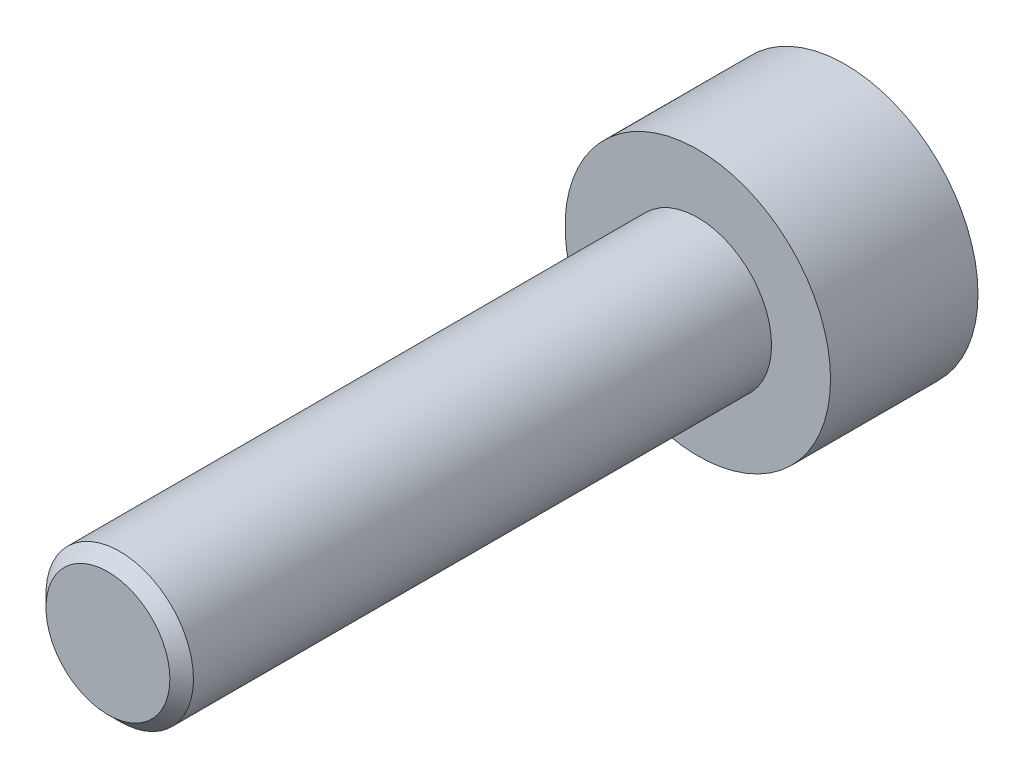
ISO-10303-21;
HEADER;
FILE_DESCRIPTION(('STEP AP214'),'2;1');
FILE_NAME('part.step','',(''),(''),'','','');
FILE_SCHEMA(('AUTOMOTIVE_DESIGN { 1 0 10303 214 1 1 1 1 }'));
ENDSEC;
DATA;
#1=APPLICATION_CONTEXT('core data for automotive mechanical design processes');
#2=APPLICATION_PROTOCOL_DEFINITION('international standard','automotive_design',2000,#1);
#3=PRODUCT_CONTEXT('',#1,'mechanical');
#4=PRODUCT('Part','Part','',(#3));
#5=PRODUCT_RELATED_PRODUCT_CATEGORY('part','',(#4));
#6=PRODUCT_DEFINITION_FORMATION('','',#4);
#7=PRODUCT_DEFINITION_CONTEXT('part definition',#1,'design');
#8=PRODUCT_DEFINITION('design','',#6,#7);
#9=PRODUCT_DEFINITION_SHAPE('','',#8);
#10=(LENGTH_UNIT() NAMED_UNIT(*) SI_UNIT(.MILLI.,.METRE.));
#11=(NAMED_UNIT(*) PLANE_ANGLE_UNIT() SI_UNIT($,.RADIAN.));
#12=(NAMED_UNIT(*) SI_UNIT($,.STERADIAN.) SOLID_ANGLE_UNIT());
#13=UNCERTAINTY_MEASURE_WITH_UNIT(LENGTH_MEASURE(1.E-05),#10,'distance_accuracy_value','');
#14=(GEOMETRIC_REPRESENTATION_CONTEXT(3) GLOBAL_UNCERTAINTY_ASSIGNED_CONTEXT((#13)) GLOBAL_UNIT_ASSIGNED_CONTEXT((#10,
#11,#12)) REPRESENTATION_CONTEXT('',''));
#15=CARTESIAN_POINT('',(0.,0.,0.));
#16=DIRECTION('',(0.,0.,1.));
#17=DIRECTION('',(1.,0.,0.));
#18=AXIS2_PLACEMENT_3D('',#15,#16,#17);
#19=CARTESIAN_POINT('',(0.,0.,2.5));
#20=DIRECTION('',(0.,0.,-1.));
#21=DIRECTION('',(-1.,0.,0.));
#22=AXIS2_PLACEMENT_3D('',#19,#20,#21);
#23=CYLINDRICAL_SURFACE('',#22,2.25);
#24=CARTESIAN_POINT('',(0.,0.,2.5));
#25=DIRECTION('',(0.,0.,1.));
#26=DIRECTION('',(1.,0.,0.));
#27=AXIS2_PLACEMENT_3D('',#24,#25,#26);
#28=CIRCLE('',#27,2.25);
#29=CARTESIAN_POINT('',(2.25,0.,2.5));
#30=VERTEX_POINT('',#29);
#31=EDGE_CURVE('E171',#30,#30,#28,.T.);
#32=ORIENTED_EDGE('',*,*,#31,.F.);
#33=EDGE_LOOP('',(#32));
#34=FACE_BOUND('',#33,.T.);
#35=CARTESIAN_POINT('',(0.,0.,0.));
#36=DIRECTION('',(0.,0.,1.));
#37=DIRECTION('',(1.,0.,0.));
#38=AXIS2_PLACEMENT_3D('',#35,#36,#37);
#39=CIRCLE('',#38,2.25);
#40=CARTESIAN_POINT('',(2.25,0.,0.));
#41=VERTEX_POINT('',#40);
#42=EDGE_CURVE('E157',#41,#41,#39,.T.);
#43=ORIENTED_EDGE('',*,*,#42,.T.);
#44=EDGE_LOOP('',(#43));
#45=FACE_BOUND('',#44,.T.);
#46=ADVANCED_FACE('F41',(#34,#45),#23,.T.);
#47=CARTESIAN_POINT('',(0.,0.,2.5));
#48=DIRECTION('',(0.,0.,1.));
#49=DIRECTION('',(1.,0.,0.));
#50=AXIS2_PLACEMENT_3D('',#47,#48,#49);
#51=PLANE('',#50);
#52=CARTESIAN_POINT('',(0.,0.,2.5));
#53=DIRECTION('',(0.,0.,1.));
#54=DIRECTION('',(1.,0.,0.));
#55=AXIS2_PLACEMENT_3D('',#52,#53,#54);
#56=CIRCLE('',#55,1.25);
#57=CARTESIAN_POINT('',(1.25,0.,2.5));
#58=VERTEX_POINT('',#57);
#59=EDGE_CURVE('E167',#58,#58,#56,.T.);
#60=ORIENTED_EDGE('',*,*,#59,.F.);
#61=EDGE_LOOP('',(#60));
#62=FACE_BOUND('',#61,.T.);
#63=ORIENTED_EDGE('',*,*,#31,.T.);
#64=EDGE_LOOP('',(#63));
#65=FACE_BOUND('',#64,.T.);
#66=ADVANCED_FACE('F196',(#62,#65),#51,.T.);
#67=CARTESIAN_POINT('',(0.,0.,0.));
#68=DIRECTION('',(0.,0.,1.));
#69=DIRECTION('',(1.,0.,0.));
#70=AXIS2_PLACEMENT_3D('',#67,#68,#69);
#71=PLANE('',#70);
#72=DIRECTION('',(0.866025403784439,-0.5,0.));
#73=VECTOR('',#72,1.);
#74=CARTESIAN_POINT('',(0.,1.17779454914684,0.));
#75=LINE('',#74,#73);
#76=CARTESIAN_POINT('',(0.,1.17779454914684,0.));
#77=VERTEX_POINT('',#76);
#78=CARTESIAN_POINT('',(1.02,0.588897274573418,0.));
#79=VERTEX_POINT('',#78);
#80=EDGE_CURVE('E138',#77,#79,#75,.T.);
#81=ORIENTED_EDGE('',*,*,#80,.F.);
#82=DIRECTION('',(0.866025403784439,0.5,0.));
#83=VECTOR('',#82,1.);
#84=CARTESIAN_POINT('',(-1.02,0.588897274573418,0.));
#85=LINE('',#84,#83);
#86=CARTESIAN_POINT('',(-1.02,0.588897274573418,0.));
#87=VERTEX_POINT('',#86);
#88=EDGE_CURVE('E58',#87,#77,#85,.T.);
#89=ORIENTED_EDGE('',*,*,#88,.F.);
#90=DIRECTION('',(0.,1.,0.));
#91=VECTOR('',#90,1.);
#92=CARTESIAN_POINT('',(-1.02,-0.588897274573418,0.));
#93=LINE('',#92,#91);
#94=CARTESIAN_POINT('',(-1.02,-0.588897274573418,0.));
#95=VERTEX_POINT('',#94);
#96=EDGE_CURVE('E151',#95,#87,#93,.T.);
#97=ORIENTED_EDGE('',*,*,#96,.F.);
#98=DIRECTION('',(-0.866025403784439,0.5,0.));
#99=VECTOR('',#98,1.);
#100=CARTESIAN_POINT('',(0.,-1.17779454914684,0.));
#101=LINE('',#100,#99);
#102=CARTESIAN_POINT('',(0.,-1.17779454914684,0.));
#103=VERTEX_POINT('',#102);
#104=EDGE_CURVE('E148',#103,#95,#101,.T.);
#105=ORIENTED_EDGE('',*,*,#104,.F.);
#106=DIRECTION('',(-0.866025403784439,-0.5,0.));
#107=VECTOR('',#106,1.);
#108=CARTESIAN_POINT('',(1.02,-0.588897274573418,0.));
#109=LINE('',#108,#107);
#110=CARTESIAN_POINT('',(1.02,-0.588897274573418,0.));
#111=VERTEX_POINT('',#110);
#112=EDGE_CURVE('E106',#111,#103,#109,.T.);
#113=ORIENTED_EDGE('',*,*,#112,.F.);
#114=DIRECTION('',(0.,-1.,0.));
#115=VECTOR('',#114,1.);
#116=CARTESIAN_POINT('',(1.02,0.588897274573418,0.));
#117=LINE('',#116,#115);
#118=EDGE_CURVE('E142',#79,#111,#117,.T.);
#119=ORIENTED_EDGE('',*,*,#118,.F.);
#120=EDGE_LOOP('',(#81,#89,#97,#105,#113,#119));
#121=FACE_BOUND('',#120,.T.);
#122=ORIENTED_EDGE('',*,*,#42,.F.);
#123=EDGE_LOOP('',(#122));
#124=FACE_BOUND('',#123,.T.);
#125=ADVANCED_FACE('F201',(#121,#124),#71,.F.);
#126=CARTESIAN_POINT('',(0.,0.,12.5));
#127=DIRECTION('',(0.,0.,-1.));
#128=DIRECTION('',(-1.,0.,0.));
#129=AXIS2_PLACEMENT_3D('',#126,#127,#128);
#130=CYLINDRICAL_SURFACE('',#129,1.25);
#131=CARTESIAN_POINT('',(0.,0.,12.3));
#132=DIRECTION('',(0.,0.,1.));
#133=DIRECTION('',(1.,0.,0.));
#134=AXIS2_PLACEMENT_3D('',#131,#132,#133);
#135=CIRCLE('',#134,1.25);
#136=CARTESIAN_POINT('',(1.25,0.,12.3));
#137=VERTEX_POINT('',#136);
#138=EDGE_CURVE('E11',#137,#137,#135,.F.);
#139=ORIENTED_EDGE('',*,*,#138,.T.);
#140=EDGE_LOOP('',(#139));
#141=FACE_BOUND('',#140,.T.);
#142=ORIENTED_EDGE('',*,*,#59,.T.);
#143=EDGE_LOOP('',(#142));
#144=FACE_BOUND('',#143,.T.);
#145=ADVANCED_FACE('F192',(#141,#144),#130,.T.);
#146=CARTESIAN_POINT('',(0.,0.,12.5));
#147=DIRECTION('',(0.,0.,1.));
#148=DIRECTION('',(1.,0.,0.));
#149=AXIS2_PLACEMENT_3D('',#146,#147,#148);
#150=PLANE('',#149);
#151=CARTESIAN_POINT('',(0.,0.,12.5));
#152=DIRECTION('',(0.,0.,1.));
#153=DIRECTION('',(1.,0.,0.));
#154=AXIS2_PLACEMENT_3D('',#151,#152,#153);
#155=CIRCLE('',#154,1.05);
#156=CARTESIAN_POINT('',(1.05,0.,12.5));
#157=VERTEX_POINT('',#156);
#158=EDGE_CURVE('E51',#157,#157,#155,.T.);
#159=ORIENTED_EDGE('',*,*,#158,.T.);
#160=EDGE_LOOP('',(#159));
#161=FACE_BOUND('',#160,.T.);
#162=ADVANCED_FACE('F181',(#161),#150,.T.);
#163=CARTESIAN_POINT('',(0.,0.,12.5));
#164=DIRECTION('',(0.,0.,-1.));
#165=DIRECTION('',(-1.,0.,0.));
#166=AXIS2_PLACEMENT_3D('',#163,#164,#165);
#167=CONICAL_SURFACE('',#166,1.05,0.785398163397446);
#168=ORIENTED_EDGE('',*,*,#138,.F.);
#169=EDGE_LOOP('',(#168));
#170=FACE_BOUND('',#169,.T.);
#171=ORIENTED_EDGE('',*,*,#158,.F.);
#172=EDGE_LOOP('',(#171));
#173=FACE_BOUND('',#172,.T.);
#174=ADVANCED_FACE('F44',(#170,#173),#167,.T.);
#175=CARTESIAN_POINT('',(-1.02,0.588897274573418,1.1));
#176=DIRECTION('',(-0.5,0.866025403784439,0.));
#177=DIRECTION('',(-0.866025403784439,-0.5,0.));
#178=AXIS2_PLACEMENT_3D('',#175,#176,#177);
#179=PLANE('',#178);
#180=ORIENTED_EDGE('',*,*,#88,.T.);
#181=DIRECTION('',(0.,0.,-1.));
#182=VECTOR('',#181,1.);
#183=CARTESIAN_POINT('',(0.,1.17779454914684,1.1));
#184=LINE('',#183,#182);
#185=CARTESIAN_POINT('',(0.,1.17779454914684,1.1));
#186=VERTEX_POINT('',#185);
#187=EDGE_CURVE('E88',#186,#77,#184,.T.);
#188=ORIENTED_EDGE('',*,*,#187,.F.);
#189=DIRECTION('',(0.866025403784439,0.5,0.));
#190=VECTOR('',#189,1.);
#191=CARTESIAN_POINT('',(-1.02,0.588897274573418,1.1));
#192=LINE('',#191,#190);
#193=CARTESIAN_POINT('',(-1.02,0.588897274573418,1.1));
#194=VERTEX_POINT('',#193);
#195=EDGE_CURVE('E154',#194,#186,#192,.T.);
#196=ORIENTED_EDGE('',*,*,#195,.F.);
#197=DIRECTION('',(0.,0.,-1.));
#198=VECTOR('',#197,1.);
#199=CARTESIAN_POINT('',(-1.02,0.588897274573418,1.1));
#200=LINE('',#199,#198);
#201=EDGE_CURVE('E66',#194,#87,#200,.T.);
#202=ORIENTED_EDGE('',*,*,#201,.T.);
#203=EDGE_LOOP('',(#180,#188,#196,#202));
#204=FACE_BOUND('',#203,.T.);
#205=ADVANCED_FACE('F184',(#204),#179,.F.);
#206=CARTESIAN_POINT('',(-1.02,-0.588897274573418,1.1));
#207=DIRECTION('',(-1.,0.,0.));
#208=DIRECTION('',(0.,0.,1.));
#209=AXIS2_PLACEMENT_3D('',#206,#207,#208);
#210=PLANE('',#209);
#211=ORIENTED_EDGE('',*,*,#96,.T.);
#212=ORIENTED_EDGE('',*,*,#201,.F.);
#213=DIRECTION('',(0.,1.,0.));
#214=VECTOR('',#213,1.);
#215=CARTESIAN_POINT('',(-1.02,-0.588897274573418,1.1));
#216=LINE('',#215,#214);
#217=CARTESIAN_POINT('',(-1.02,-0.588897274573418,1.1));
#218=VERTEX_POINT('',#217);
#219=EDGE_CURVE('E120',#218,#194,#216,.T.);
#220=ORIENTED_EDGE('',*,*,#219,.F.);
#221=DIRECTION('',(0.,0.,-1.));
#222=VECTOR('',#221,1.);
#223=CARTESIAN_POINT('',(-1.02,-0.588897274573418,1.1));
#224=LINE('',#223,#222);
#225=EDGE_CURVE('E111',#218,#95,#224,.T.);
#226=ORIENTED_EDGE('',*,*,#225,.T.);
#227=EDGE_LOOP('',(#211,#212,#220,#226));
#228=FACE_BOUND('',#227,.T.);
#229=ADVANCED_FACE('F190',(#228),#210,.F.);
#230=CARTESIAN_POINT('',(0.,-1.17779454914684,1.1));
#231=DIRECTION('',(-0.5,-0.866025403784439,0.));
#232=DIRECTION('',(0.866025403784439,-0.5,0.));
#233=AXIS2_PLACEMENT_3D('',#230,#231,#232);
#234=PLANE('',#233);
#235=ORIENTED_EDGE('',*,*,#104,.T.);
#236=ORIENTED_EDGE('',*,*,#225,.F.);
#237=DIRECTION('',(-0.866025403784439,0.5,0.));
#238=VECTOR('',#237,1.);
#239=CARTESIAN_POINT('',(0.,-1.17779454914684,1.1));
#240=LINE('',#239,#238);
#241=CARTESIAN_POINT('',(0.,-1.17779454914684,1.1));
#242=VERTEX_POINT('',#241);
#243=EDGE_CURVE('E115',#242,#218,#240,.T.);
#244=ORIENTED_EDGE('',*,*,#243,.F.);
#245=DIRECTION('',(0.,0.,-1.));
#246=VECTOR('',#245,1.);
#247=CARTESIAN_POINT('',(0.,-1.17779454914684,1.1));
#248=LINE('',#247,#246);
#249=EDGE_CURVE('E99',#242,#103,#248,.T.);
#250=ORIENTED_EDGE('',*,*,#249,.T.);
#251=EDGE_LOOP('',(#235,#236,#244,#250));
#252=FACE_BOUND('',#251,.T.);
#253=ADVANCED_FACE('F116',(#252),#234,.F.);
#254=CARTESIAN_POINT('',(1.02,-0.588897274573418,1.1));
#255=DIRECTION('',(0.5,-0.866025403784439,0.));
#256=DIRECTION('',(0.866025403784439,0.5,0.));
#257=AXIS2_PLACEMENT_3D('',#254,#255,#256);
#258=PLANE('',#257);
#259=ORIENTED_EDGE('',*,*,#112,.T.);
#260=ORIENTED_EDGE('',*,*,#249,.F.);
#261=DIRECTION('',(-0.866025403784439,-0.5,0.));
#262=VECTOR('',#261,1.);
#263=CARTESIAN_POINT('',(1.02,-0.588897274573418,1.1));
#264=LINE('',#263,#262);
#265=CARTESIAN_POINT('',(1.02,-0.588897274573418,1.1));
#266=VERTEX_POINT('',#265);
#267=EDGE_CURVE('E103',#266,#242,#264,.T.);
#268=ORIENTED_EDGE('',*,*,#267,.F.);
#269=DIRECTION('',(0.,0.,-1.));
#270=VECTOR('',#269,1.);
#271=CARTESIAN_POINT('',(1.02,-0.588897274573418,1.1));
#272=LINE('',#271,#270);
#273=EDGE_CURVE('E112',#266,#111,#272,.T.);
#274=ORIENTED_EDGE('',*,*,#273,.T.);
#275=EDGE_LOOP('',(#259,#260,#268,#274));
#276=FACE_BOUND('',#275,.T.);
#277=ADVANCED_FACE('F101',(#276),#258,.F.);
#278=CARTESIAN_POINT('',(1.02,0.588897274573418,1.1));
#279=DIRECTION('',(1.,0.,0.));
#280=DIRECTION('',(0.,0.,-1.));
#281=AXIS2_PLACEMENT_3D('',#278,#279,#280);
#282=PLANE('',#281);
#283=ORIENTED_EDGE('',*,*,#118,.T.);
#284=ORIENTED_EDGE('',*,*,#273,.F.);
#285=DIRECTION('',(0.,-1.,0.));
#286=VECTOR('',#285,1.);
#287=CARTESIAN_POINT('',(1.02,0.588897274573418,1.1));
#288=LINE('',#287,#286);
#289=CARTESIAN_POINT('',(1.02,0.588897274573418,1.1));
#290=VERTEX_POINT('',#289);
#291=EDGE_CURVE('E126',#290,#266,#288,.T.);
#292=ORIENTED_EDGE('',*,*,#291,.F.);
#293=DIRECTION('',(0.,0.,-1.));
#294=VECTOR('',#293,1.);
#295=CARTESIAN_POINT('',(1.02,0.588897274573418,1.1));
#296=LINE('',#295,#294);
#297=EDGE_CURVE('E162',#290,#79,#296,.T.);
#298=ORIENTED_EDGE('',*,*,#297,.T.);
#299=EDGE_LOOP('',(#283,#284,#292,#298));
#300=FACE_BOUND('',#299,.T.);
#301=ADVANCED_FACE('F216',(#300),#282,.F.);
#302=CARTESIAN_POINT('',(0.,1.17779454914684,1.1));
#303=DIRECTION('',(0.5,0.866025403784439,0.));
#304=DIRECTION('',(-0.866025403784439,0.5,0.));
#305=AXIS2_PLACEMENT_3D('',#302,#303,#304);
#306=PLANE('',#305);
#307=ORIENTED_EDGE('',*,*,#80,.T.);
#308=ORIENTED_EDGE('',*,*,#297,.F.);
#309=DIRECTION('',(0.866025403784439,-0.5,0.));
#310=VECTOR('',#309,1.);
#311=CARTESIAN_POINT('',(0.,1.17779454914684,1.1));
#312=LINE('',#311,#310);
#313=EDGE_CURVE('E130',#186,#290,#312,.T.);
#314=ORIENTED_EDGE('',*,*,#313,.F.);
#315=ORIENTED_EDGE('',*,*,#187,.T.);
#316=EDGE_LOOP('',(#307,#308,#314,#315));
#317=FACE_BOUND('',#316,.T.);
#318=ADVANCED_FACE('F213',(#317),#306,.F.);
#319=CARTESIAN_POINT('',(0.,0.,1.1));
#320=DIRECTION('',(0.,0.,-1.));
#321=DIRECTION('',(-1.,0.,0.));
#322=AXIS2_PLACEMENT_3D('',#319,#320,#321);
#323=PLANE('',#322);
#324=ORIENTED_EDGE('',*,*,#195,.T.);
#325=ORIENTED_EDGE('',*,*,#313,.T.);
#326=ORIENTED_EDGE('',*,*,#291,.T.);
#327=ORIENTED_EDGE('',*,*,#267,.T.);
#328=ORIENTED_EDGE('',*,*,#243,.T.);
#329=ORIENTED_EDGE('',*,*,#219,.T.);
#330=EDGE_LOOP('',(#324,#325,#326,#327,#328,#329));
#331=FACE_BOUND('',#330,.T.);
#332=ADVANCED_FACE('F123',(#331),#323,.T.);
#333=CLOSED_SHELL('',(#46,#66,#125,#145,#162,#174,#205,#229,#253,#277,#301,#318,#332));
#334=MANIFOLD_SOLID_BREP('B2',#333);
#335=ADVANCED_BREP_SHAPE_REPRESENTATION('',(#18,#334),#14);
#336=SHAPE_DEFINITION_REPRESENTATION(#9,#335);
ENDSEC;
END-ISO-10303-21;
